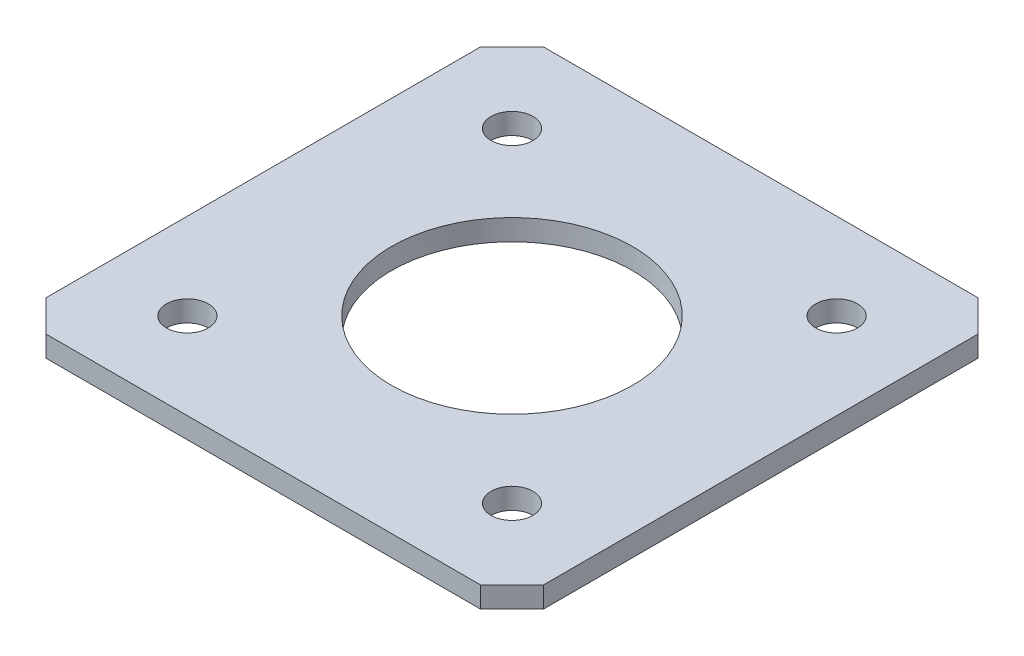
ISO-10303-21;
HEADER;
FILE_DESCRIPTION(('STEP AP214'),'2;1');
FILE_NAME('part.step','',(''),(''),'','','');
FILE_SCHEMA(('AUTOMOTIVE_DESIGN { 1 0 10303 214 1 1 1 1 }'));
ENDSEC;
DATA;
#1=APPLICATION_CONTEXT('core data for automotive mechanical design processes');
#2=APPLICATION_PROTOCOL_DEFINITION('international standard','automotive_design',2000,#1);
#3=PRODUCT_CONTEXT('',#1,'mechanical');
#4=PRODUCT('Part','Part','',(#3));
#5=PRODUCT_RELATED_PRODUCT_CATEGORY('part','',(#4));
#6=PRODUCT_DEFINITION_FORMATION('','',#4);
#7=PRODUCT_DEFINITION_CONTEXT('part definition',#1,'design');
#8=PRODUCT_DEFINITION('design','',#6,#7);
#9=PRODUCT_DEFINITION_SHAPE('','',#8);
#10=(LENGTH_UNIT() NAMED_UNIT(*) SI_UNIT(.MILLI.,.METRE.));
#11=(NAMED_UNIT(*) PLANE_ANGLE_UNIT() SI_UNIT($,.RADIAN.));
#12=(NAMED_UNIT(*) SI_UNIT($,.STERADIAN.) SOLID_ANGLE_UNIT());
#13=UNCERTAINTY_MEASURE_WITH_UNIT(LENGTH_MEASURE(1.E-05),#10,'distance_accuracy_value','');
#14=(GEOMETRIC_REPRESENTATION_CONTEXT(3) GLOBAL_UNCERTAINTY_ASSIGNED_CONTEXT((#13)) GLOBAL_UNIT_ASSIGNED_CONTEXT((#10,
#11,#12)) REPRESENTATION_CONTEXT('',''));
#15=CARTESIAN_POINT('',(0.,0.,0.));
#16=DIRECTION('',(0.,0.,1.));
#17=DIRECTION('',(1.,0.,0.));
#18=AXIS2_PLACEMENT_3D('',#15,#16,#17);
#19=CARTESIAN_POINT('',(0.,2.,0.));
#20=DIRECTION('',(0.,-1.,0.));
#21=DIRECTION('',(0.,0.,-1.));
#22=AXIS2_PLACEMENT_3D('',#19,#20,#21);
#23=PLANE('',#22);
#24=DIRECTION('',(0.,0.,-1.));
#25=VECTOR('',#24,1.);
#26=CARTESIAN_POINT('',(23.75,2.,23.75));
#27=LINE('',#26,#25);
#28=CARTESIAN_POINT('',(23.75,2.,20.75));
#29=VERTEX_POINT('',#28);
#30=CARTESIAN_POINT('',(23.75,2.,-20.75));
#31=VERTEX_POINT('',#30);
#32=EDGE_CURVE('E143',#29,#31,#27,.T.);
#33=ORIENTED_EDGE('',*,*,#32,.T.);
#34=DIRECTION('',(0.707106781186546,0.,0.707106781186549));
#35=VECTOR('',#34,1.);
#36=CARTESIAN_POINT('',(20.75,2.,-23.75));
#37=LINE('',#36,#35);
#38=CARTESIAN_POINT('',(20.75,2.,-23.75));
#39=VERTEX_POINT('',#38);
#40=EDGE_CURVE('E158',#31,#39,#37,.F.);
#41=ORIENTED_EDGE('',*,*,#40,.T.);
#42=DIRECTION('',(-1.,0.,0.));
#43=VECTOR('',#42,1.);
#44=CARTESIAN_POINT('',(-23.75,2.,-23.75));
#45=LINE('',#44,#43);
#46=CARTESIAN_POINT('',(-20.75,2.,-23.75));
#47=VERTEX_POINT('',#46);
#48=EDGE_CURVE('E125',#39,#47,#45,.T.);
#49=ORIENTED_EDGE('',*,*,#48,.T.);
#50=DIRECTION('',(0.707106781186549,0.,-0.707106781186546));
#51=VECTOR('',#50,1.);
#52=CARTESIAN_POINT('',(-23.75,2.,-20.75));
#53=LINE('',#52,#51);
#54=CARTESIAN_POINT('',(-23.75,2.,-20.75));
#55=VERTEX_POINT('',#54);
#56=EDGE_CURVE('E156',#47,#55,#53,.F.);
#57=ORIENTED_EDGE('',*,*,#56,.T.);
#58=DIRECTION('',(0.,0.,1.));
#59=VECTOR('',#58,1.);
#60=CARTESIAN_POINT('',(-23.75,2.,23.75));
#61=LINE('',#60,#59);
#62=CARTESIAN_POINT('',(-23.75,2.,20.75));
#63=VERTEX_POINT('',#62);
#64=EDGE_CURVE('E169',#55,#63,#61,.T.);
#65=ORIENTED_EDGE('',*,*,#64,.T.);
#66=DIRECTION('',(-0.707106781186546,0.,-0.707106781186549));
#67=VECTOR('',#66,1.);
#68=CARTESIAN_POINT('',(-20.75,2.,23.75));
#69=LINE('',#68,#67);
#70=CARTESIAN_POINT('',(-20.75,2.,23.75));
#71=VERTEX_POINT('',#70);
#72=EDGE_CURVE('E60',#63,#71,#69,.F.);
#73=ORIENTED_EDGE('',*,*,#72,.T.);
#74=DIRECTION('',(1.,0.,0.));
#75=VECTOR('',#74,1.);
#76=CARTESIAN_POINT('',(-23.75,2.,23.75));
#77=LINE('',#76,#75);
#78=CARTESIAN_POINT('',(20.75,2.,23.75));
#79=VERTEX_POINT('',#78);
#80=EDGE_CURVE('E144',#71,#79,#77,.T.);
#81=ORIENTED_EDGE('',*,*,#80,.T.);
#82=DIRECTION('',(-0.707106781186549,0.,0.707106781186546));
#83=VECTOR('',#82,1.);
#84=CARTESIAN_POINT('',(23.75,2.,20.75));
#85=LINE('',#84,#83);
#86=EDGE_CURVE('E153',#79,#29,#85,.F.);
#87=ORIENTED_EDGE('',*,*,#86,.T.);
#88=EDGE_LOOP('',(#33,#41,#49,#57,#65,#73,#81,#87));
#89=FACE_BOUND('',#88,.T.);
#90=CARTESIAN_POINT('',(-15.5,2.,-15.5));
#91=DIRECTION('',(0.,1.,0.));
#92=DIRECTION('',(0.,0.,1.));
#93=AXIS2_PLACEMENT_3D('',#90,#91,#92);
#94=CIRCLE('',#93,2.);
#95=CARTESIAN_POINT('',(-15.5,2.,-13.5));
#96=VERTEX_POINT('',#95);
#97=EDGE_CURVE('E138',#96,#96,#94,.T.);
#98=ORIENTED_EDGE('',*,*,#97,.F.);
#99=EDGE_LOOP('',(#98));
#100=FACE_BOUND('',#99,.T.);
#101=CARTESIAN_POINT('',(0.,2.,0.));
#102=DIRECTION('',(0.,1.,0.));
#103=DIRECTION('',(0.,0.,1.));
#104=AXIS2_PLACEMENT_3D('',#101,#102,#103);
#105=CIRCLE('',#104,11.5);
#106=CARTESIAN_POINT('',(0.,2.,11.5));
#107=VERTEX_POINT('',#106);
#108=EDGE_CURVE('E186',#107,#107,#105,.T.);
#109=ORIENTED_EDGE('',*,*,#108,.F.);
#110=EDGE_LOOP('',(#109));
#111=FACE_BOUND('',#110,.T.);
#112=CARTESIAN_POINT('',(15.5,2.,-15.5000000000009));
#113=DIRECTION('',(0.,1.,0.));
#114=DIRECTION('',(0.,0.,1.));
#115=AXIS2_PLACEMENT_3D('',#112,#113,#114);
#116=CIRCLE('',#115,2.);
#117=CARTESIAN_POINT('',(15.5,2.,-13.5000000000009));
#118=VERTEX_POINT('',#117);
#119=EDGE_CURVE('E192',#118,#118,#116,.T.);
#120=ORIENTED_EDGE('',*,*,#119,.F.);
#121=EDGE_LOOP('',(#120));
#122=FACE_BOUND('',#121,.T.);
#123=CARTESIAN_POINT('',(15.5000000000009,2.,15.4999999999991));
#124=DIRECTION('',(0.,1.,0.));
#125=DIRECTION('',(0.,0.,1.));
#126=AXIS2_PLACEMENT_3D('',#123,#124,#125);
#127=CIRCLE('',#126,2.);
#128=CARTESIAN_POINT('',(15.5000000000009,2.,17.4999999999991));
#129=VERTEX_POINT('',#128);
#130=EDGE_CURVE('E198',#129,#129,#127,.T.);
#131=ORIENTED_EDGE('',*,*,#130,.F.);
#132=EDGE_LOOP('',(#131));
#133=FACE_BOUND('',#132,.T.);
#134=CARTESIAN_POINT('',(-15.4999999999991,2.,15.5));
#135=DIRECTION('',(0.,1.,0.));
#136=DIRECTION('',(0.,0.,1.));
#137=AXIS2_PLACEMENT_3D('',#134,#135,#136);
#138=CIRCLE('',#137,2.);
#139=CARTESIAN_POINT('',(-15.4999999999991,2.,17.5));
#140=VERTEX_POINT('',#139);
#141=EDGE_CURVE('E204',#140,#140,#138,.T.);
#142=ORIENTED_EDGE('',*,*,#141,.F.);
#143=EDGE_LOOP('',(#142));
#144=FACE_BOUND('',#143,.T.);
#145=ADVANCED_FACE('F38',(#89,#100,#111,#122,#133,#144),#23,.F.);
#146=CARTESIAN_POINT('',(0.,0.,0.));
#147=DIRECTION('',(0.,-1.,0.));
#148=DIRECTION('',(0.,0.,-1.));
#149=AXIS2_PLACEMENT_3D('',#146,#147,#148);
#150=PLANE('',#149);
#151=CARTESIAN_POINT('',(15.5000000000009,0.,15.4999999999991));
#152=DIRECTION('',(0.,1.,0.));
#153=DIRECTION('',(0.,0.,1.));
#154=AXIS2_PLACEMENT_3D('',#151,#152,#153);
#155=CIRCLE('',#154,2.);
#156=CARTESIAN_POINT('',(15.5000000000009,0.,17.4999999999991));
#157=VERTEX_POINT('',#156);
#158=EDGE_CURVE('E201',#157,#157,#155,.T.);
#159=ORIENTED_EDGE('',*,*,#158,.T.);
#160=EDGE_LOOP('',(#159));
#161=FACE_BOUND('',#160,.T.);
#162=CARTESIAN_POINT('',(0.,0.,0.));
#163=DIRECTION('',(0.,1.,0.));
#164=DIRECTION('',(0.,0.,1.));
#165=AXIS2_PLACEMENT_3D('',#162,#163,#164);
#166=CIRCLE('',#165,11.5);
#167=CARTESIAN_POINT('',(0.,0.,11.5));
#168=VERTEX_POINT('',#167);
#169=EDGE_CURVE('E189',#168,#168,#166,.T.);
#170=ORIENTED_EDGE('',*,*,#169,.T.);
#171=EDGE_LOOP('',(#170));
#172=FACE_BOUND('',#171,.T.);
#173=DIRECTION('',(-1.,0.,0.));
#174=VECTOR('',#173,1.);
#175=CARTESIAN_POINT('',(-23.75,0.,-23.75));
#176=LINE('',#175,#174);
#177=CARTESIAN_POINT('',(20.75,0.,-23.75));
#178=VERTEX_POINT('',#177);
#179=CARTESIAN_POINT('',(-20.75,0.,-23.75));
#180=VERTEX_POINT('',#179);
#181=EDGE_CURVE('E122',#178,#180,#176,.T.);
#182=ORIENTED_EDGE('',*,*,#181,.F.);
#183=DIRECTION('',(-0.707106781186546,0.,-0.707106781186549));
#184=VECTOR('',#183,1.);
#185=CARTESIAN_POINT('',(22.25,0.,-22.2499999999999));
#186=LINE('',#185,#184);
#187=CARTESIAN_POINT('',(23.75,0.,-20.75));
#188=VERTEX_POINT('',#187);
#189=EDGE_CURVE('E105',#178,#188,#186,.F.);
#190=ORIENTED_EDGE('',*,*,#189,.T.);
#191=DIRECTION('',(0.,0.,-1.));
#192=VECTOR('',#191,1.);
#193=CARTESIAN_POINT('',(23.75,0.,23.75));
#194=LINE('',#193,#192);
#195=CARTESIAN_POINT('',(23.75,0.,20.75));
#196=VERTEX_POINT('',#195);
#197=EDGE_CURVE('E133',#196,#188,#194,.T.);
#198=ORIENTED_EDGE('',*,*,#197,.F.);
#199=DIRECTION('',(0.707106781186549,0.,-0.707106781186546));
#200=VECTOR('',#199,1.);
#201=CARTESIAN_POINT('',(22.2499999999999,0.,22.25));
#202=LINE('',#201,#200);
#203=CARTESIAN_POINT('',(20.75,0.,23.75));
#204=VERTEX_POINT('',#203);
#205=EDGE_CURVE('E126',#196,#204,#202,.F.);
#206=ORIENTED_EDGE('',*,*,#205,.T.);
#207=DIRECTION('',(1.,0.,0.));
#208=VECTOR('',#207,1.);
#209=CARTESIAN_POINT('',(-23.75,0.,23.75));
#210=LINE('',#209,#208);
#211=CARTESIAN_POINT('',(-20.75,0.,23.75));
#212=VERTEX_POINT('',#211);
#213=EDGE_CURVE('E136',#212,#204,#210,.T.);
#214=ORIENTED_EDGE('',*,*,#213,.F.);
#215=DIRECTION('',(0.707106781186546,0.,0.707106781186549));
#216=VECTOR('',#215,1.);
#217=CARTESIAN_POINT('',(-22.25,0.,22.2499999999999));
#218=LINE('',#217,#216);
#219=CARTESIAN_POINT('',(-23.75,0.,20.75));
#220=VERTEX_POINT('',#219);
#221=EDGE_CURVE('E147',#212,#220,#218,.F.);
#222=ORIENTED_EDGE('',*,*,#221,.T.);
#223=DIRECTION('',(0.,0.,1.));
#224=VECTOR('',#223,1.);
#225=CARTESIAN_POINT('',(-23.75,0.,23.75));
#226=LINE('',#225,#224);
#227=CARTESIAN_POINT('',(-23.75,0.,-20.75));
#228=VERTEX_POINT('',#227);
#229=EDGE_CURVE('E132',#228,#220,#226,.T.);
#230=ORIENTED_EDGE('',*,*,#229,.F.);
#231=DIRECTION('',(-0.707106781186549,0.,0.707106781186546));
#232=VECTOR('',#231,1.);
#233=CARTESIAN_POINT('',(-22.2499999999999,0.,-22.25));
#234=LINE('',#233,#232);
#235=EDGE_CURVE('E116',#228,#180,#234,.F.);
#236=ORIENTED_EDGE('',*,*,#235,.T.);
#237=EDGE_LOOP('',(#182,#190,#198,#206,#214,#222,#230,#236));
#238=FACE_BOUND('',#237,.T.);
#239=CARTESIAN_POINT('',(-15.5,0.,-15.5));
#240=DIRECTION('',(0.,1.,0.));
#241=DIRECTION('',(0.,0.,1.));
#242=AXIS2_PLACEMENT_3D('',#239,#240,#241);
#243=CIRCLE('',#242,2.);
#244=CARTESIAN_POINT('',(-15.5,0.,-13.5));
#245=VERTEX_POINT('',#244);
#246=EDGE_CURVE('E183',#245,#245,#243,.T.);
#247=ORIENTED_EDGE('',*,*,#246,.T.);
#248=EDGE_LOOP('',(#247));
#249=FACE_BOUND('',#248,.T.);
#250=CARTESIAN_POINT('',(15.5,0.,-15.5000000000009));
#251=DIRECTION('',(0.,1.,0.));
#252=DIRECTION('',(0.,0.,1.));
#253=AXIS2_PLACEMENT_3D('',#250,#251,#252);
#254=CIRCLE('',#253,2.);
#255=CARTESIAN_POINT('',(15.5,0.,-13.5000000000009));
#256=VERTEX_POINT('',#255);
#257=EDGE_CURVE('E195',#256,#256,#254,.T.);
#258=ORIENTED_EDGE('',*,*,#257,.T.);
#259=EDGE_LOOP('',(#258));
#260=FACE_BOUND('',#259,.T.);
#261=CARTESIAN_POINT('',(-15.4999999999991,0.,15.5));
#262=DIRECTION('',(0.,1.,0.));
#263=DIRECTION('',(0.,0.,1.));
#264=AXIS2_PLACEMENT_3D('',#261,#262,#263);
#265=CIRCLE('',#264,2.);
#266=CARTESIAN_POINT('',(-15.4999999999991,0.,17.5));
#267=VERTEX_POINT('',#266);
#268=EDGE_CURVE('E207',#267,#267,#265,.T.);
#269=ORIENTED_EDGE('',*,*,#268,.T.);
#270=EDGE_LOOP('',(#269));
#271=FACE_BOUND('',#270,.T.);
#272=ADVANCED_FACE('F129',(#161,#172,#238,#249,#260,#271),#150,.T.);
#273=CARTESIAN_POINT('',(23.75,2.,23.75));
#274=DIRECTION('',(-1.,0.,0.));
#275=DIRECTION('',(0.,0.,1.));
#276=AXIS2_PLACEMENT_3D('',#273,#274,#275);
#277=PLANE('',#276);
#278=ORIENTED_EDGE('',*,*,#197,.T.);
#279=DIRECTION('',(0.,1.,0.));
#280=VECTOR('',#279,1.);
#281=CARTESIAN_POINT('',(23.75,2.,-20.75));
#282=LINE('',#281,#280);
#283=EDGE_CURVE('E110',#188,#31,#282,.T.);
#284=ORIENTED_EDGE('',*,*,#283,.T.);
#285=ORIENTED_EDGE('',*,*,#32,.F.);
#286=DIRECTION('',(0.,-1.,0.));
#287=VECTOR('',#286,1.);
#288=CARTESIAN_POINT('',(23.75,2.,20.75));
#289=LINE('',#288,#287);
#290=EDGE_CURVE('E115',#29,#196,#289,.T.);
#291=ORIENTED_EDGE('',*,*,#290,.T.);
#292=EDGE_LOOP('',(#278,#284,#285,#291));
#293=FACE_BOUND('',#292,.T.);
#294=ADVANCED_FACE('F221',(#293),#277,.F.);
#295=CARTESIAN_POINT('',(-23.75,2.,-23.75));
#296=DIRECTION('',(0.,0.,1.));
#297=DIRECTION('',(1.,0.,0.));
#298=AXIS2_PLACEMENT_3D('',#295,#296,#297);
#299=PLANE('',#298);
#300=ORIENTED_EDGE('',*,*,#48,.F.);
#301=DIRECTION('',(0.,-1.,0.));
#302=VECTOR('',#301,1.);
#303=CARTESIAN_POINT('',(20.75,2.,-23.75));
#304=LINE('',#303,#302);
#305=EDGE_CURVE('E109',#39,#178,#304,.T.);
#306=ORIENTED_EDGE('',*,*,#305,.T.);
#307=ORIENTED_EDGE('',*,*,#181,.T.);
#308=DIRECTION('',(0.,1.,0.));
#309=VECTOR('',#308,1.);
#310=CARTESIAN_POINT('',(-20.75,2.,-23.75));
#311=LINE('',#310,#309);
#312=EDGE_CURVE('E127',#180,#47,#311,.T.);
#313=ORIENTED_EDGE('',*,*,#312,.T.);
#314=EDGE_LOOP('',(#300,#306,#307,#313));
#315=FACE_BOUND('',#314,.T.);
#316=ADVANCED_FACE('F121',(#315),#299,.F.);
#317=CARTESIAN_POINT('',(-23.75,2.,23.75));
#318=DIRECTION('',(1.,0.,0.));
#319=DIRECTION('',(0.,0.,-1.));
#320=AXIS2_PLACEMENT_3D('',#317,#318,#319);
#321=PLANE('',#320);
#322=ORIENTED_EDGE('',*,*,#64,.F.);
#323=DIRECTION('',(0.,-1.,0.));
#324=VECTOR('',#323,1.);
#325=CARTESIAN_POINT('',(-23.75,2.,-20.75));
#326=LINE('',#325,#324);
#327=EDGE_CURVE('E162',#55,#228,#326,.T.);
#328=ORIENTED_EDGE('',*,*,#327,.T.);
#329=ORIENTED_EDGE('',*,*,#229,.T.);
#330=DIRECTION('',(0.,1.,0.));
#331=VECTOR('',#330,1.);
#332=CARTESIAN_POINT('',(-23.75,2.,20.75));
#333=LINE('',#332,#331);
#334=EDGE_CURVE('E160',#220,#63,#333,.T.);
#335=ORIENTED_EDGE('',*,*,#334,.T.);
#336=EDGE_LOOP('',(#322,#328,#329,#335));
#337=FACE_BOUND('',#336,.T.);
#338=ADVANCED_FACE('F167',(#337),#321,.F.);
#339=CARTESIAN_POINT('',(-23.75,2.,23.75));
#340=DIRECTION('',(0.,0.,-1.));
#341=DIRECTION('',(-1.,0.,0.));
#342=AXIS2_PLACEMENT_3D('',#339,#340,#341);
#343=PLANE('',#342);
#344=ORIENTED_EDGE('',*,*,#80,.F.);
#345=DIRECTION('',(0.,-1.,0.));
#346=VECTOR('',#345,1.);
#347=CARTESIAN_POINT('',(-20.75,2.,23.75));
#348=LINE('',#347,#346);
#349=EDGE_CURVE('E11',#71,#212,#348,.T.);
#350=ORIENTED_EDGE('',*,*,#349,.T.);
#351=ORIENTED_EDGE('',*,*,#213,.T.);
#352=DIRECTION('',(0.,1.,0.));
#353=VECTOR('',#352,1.);
#354=CARTESIAN_POINT('',(20.75,2.,23.75));
#355=LINE('',#354,#353);
#356=EDGE_CURVE('E47',#204,#79,#355,.T.);
#357=ORIENTED_EDGE('',*,*,#356,.T.);
#358=EDGE_LOOP('',(#344,#350,#351,#357));
#359=FACE_BOUND('',#358,.T.);
#360=ADVANCED_FACE('F176',(#359),#343,.F.);
#361=CARTESIAN_POINT('',(-15.5,2.,-15.5));
#362=DIRECTION('',(0.,-1.,0.));
#363=DIRECTION('',(0.,0.,-1.));
#364=AXIS2_PLACEMENT_3D('',#361,#362,#363);
#365=CYLINDRICAL_SURFACE('',#364,2.);
#366=ORIENTED_EDGE('',*,*,#97,.T.);
#367=EDGE_LOOP('',(#366));
#368=FACE_BOUND('',#367,.T.);
#369=ORIENTED_EDGE('',*,*,#246,.F.);
#370=EDGE_LOOP('',(#369));
#371=FACE_BOUND('',#370,.T.);
#372=ADVANCED_FACE('F226',(#368,#371),#365,.F.);
#373=CARTESIAN_POINT('',(0.,2.,0.));
#374=DIRECTION('',(0.,-1.,0.));
#375=DIRECTION('',(0.,0.,-1.));
#376=AXIS2_PLACEMENT_3D('',#373,#374,#375);
#377=CYLINDRICAL_SURFACE('',#376,11.5);
#378=ORIENTED_EDGE('',*,*,#108,.T.);
#379=EDGE_LOOP('',(#378));
#380=FACE_BOUND('',#379,.T.);
#381=ORIENTED_EDGE('',*,*,#169,.F.);
#382=EDGE_LOOP('',(#381));
#383=FACE_BOUND('',#382,.T.);
#384=ADVANCED_FACE('F340',(#380,#383),#377,.F.);
#385=CARTESIAN_POINT('',(15.5,2.,-15.5000000000009));
#386=DIRECTION('',(0.,-1.,0.));
#387=DIRECTION('',(0.,0.,-1.));
#388=AXIS2_PLACEMENT_3D('',#385,#386,#387);
#389=CYLINDRICAL_SURFACE('',#388,2.);
#390=ORIENTED_EDGE('',*,*,#119,.T.);
#391=EDGE_LOOP('',(#390));
#392=FACE_BOUND('',#391,.T.);
#393=ORIENTED_EDGE('',*,*,#257,.F.);
#394=EDGE_LOOP('',(#393));
#395=FACE_BOUND('',#394,.T.);
#396=ADVANCED_FACE('F330',(#392,#395),#389,.F.);
#397=CARTESIAN_POINT('',(15.5000000000009,2.,15.4999999999991));
#398=DIRECTION('',(0.,-1.,0.));
#399=DIRECTION('',(0.,0.,-1.));
#400=AXIS2_PLACEMENT_3D('',#397,#398,#399);
#401=CYLINDRICAL_SURFACE('',#400,2.);
#402=ORIENTED_EDGE('',*,*,#130,.T.);
#403=EDGE_LOOP('',(#402));
#404=FACE_BOUND('',#403,.T.);
#405=ORIENTED_EDGE('',*,*,#158,.F.);
#406=EDGE_LOOP('',(#405));
#407=FACE_BOUND('',#406,.T.);
#408=ADVANCED_FACE('F321',(#404,#407),#401,.F.);
#409=CARTESIAN_POINT('',(-15.4999999999991,2.,15.5));
#410=DIRECTION('',(0.,-1.,0.));
#411=DIRECTION('',(0.,0.,-1.));
#412=AXIS2_PLACEMENT_3D('',#409,#410,#411);
#413=CYLINDRICAL_SURFACE('',#412,2.);
#414=ORIENTED_EDGE('',*,*,#141,.T.);
#415=EDGE_LOOP('',(#414));
#416=FACE_BOUND('',#415,.T.);
#417=ORIENTED_EDGE('',*,*,#268,.F.);
#418=EDGE_LOOP('',(#417));
#419=FACE_BOUND('',#418,.T.);
#420=ADVANCED_FACE('F213',(#416,#419),#413,.F.);
#421=CARTESIAN_POINT('',(20.75,2.,-23.75));
#422=DIRECTION('',(-0.707106781186549,0.,0.707106781186546));
#423=DIRECTION('',(0.,-1.,0.));
#424=AXIS2_PLACEMENT_3D('',#421,#422,#423);
#425=PLANE('',#424);
#426=ORIENTED_EDGE('',*,*,#40,.F.);
#427=ORIENTED_EDGE('',*,*,#283,.F.);
#428=ORIENTED_EDGE('',*,*,#189,.F.);
#429=ORIENTED_EDGE('',*,*,#305,.F.);
#430=EDGE_LOOP('',(#426,#427,#428,#429));
#431=FACE_BOUND('',#430,.T.);
#432=ADVANCED_FACE('F108',(#431),#425,.F.);
#433=CARTESIAN_POINT('',(-23.75,2.,-20.75));
#434=DIRECTION('',(0.707106781186546,0.,0.707106781186549));
#435=DIRECTION('',(0.,-1.,0.));
#436=AXIS2_PLACEMENT_3D('',#433,#434,#435);
#437=PLANE('',#436);
#438=ORIENTED_EDGE('',*,*,#56,.F.);
#439=ORIENTED_EDGE('',*,*,#312,.F.);
#440=ORIENTED_EDGE('',*,*,#235,.F.);
#441=ORIENTED_EDGE('',*,*,#327,.F.);
#442=EDGE_LOOP('',(#438,#439,#440,#441));
#443=FACE_BOUND('',#442,.T.);
#444=ADVANCED_FACE('F244',(#443),#437,.F.);
#445=CARTESIAN_POINT('',(-20.75,2.,23.75));
#446=DIRECTION('',(0.707106781186549,0.,-0.707106781186546));
#447=DIRECTION('',(0.,-1.,0.));
#448=AXIS2_PLACEMENT_3D('',#445,#446,#447);
#449=PLANE('',#448);
#450=ORIENTED_EDGE('',*,*,#72,.F.);
#451=ORIENTED_EDGE('',*,*,#334,.F.);
#452=ORIENTED_EDGE('',*,*,#221,.F.);
#453=ORIENTED_EDGE('',*,*,#349,.F.);
#454=EDGE_LOOP('',(#450,#451,#452,#453));
#455=FACE_BOUND('',#454,.T.);
#456=ADVANCED_FACE('F175',(#455),#449,.F.);
#457=CARTESIAN_POINT('',(23.75,2.,20.75));
#458=DIRECTION('',(-0.707106781186546,0.,-0.707106781186549));
#459=DIRECTION('',(0.,-1.,0.));
#460=AXIS2_PLACEMENT_3D('',#457,#458,#459);
#461=PLANE('',#460);
#462=ORIENTED_EDGE('',*,*,#86,.F.);
#463=ORIENTED_EDGE('',*,*,#356,.F.);
#464=ORIENTED_EDGE('',*,*,#205,.F.);
#465=ORIENTED_EDGE('',*,*,#290,.F.);
#466=EDGE_LOOP('',(#462,#463,#464,#465));
#467=FACE_BOUND('',#466,.T.);
#468=ADVANCED_FACE('F41',(#467),#461,.F.);
#469=CLOSED_SHELL('',(#145,#272,#294,#316,#338,#360,#372,#384,#396,#408,#420,#432,#444,#456,#468));
#470=MANIFOLD_SOLID_BREP('B2',#469);
#471=ADVANCED_BREP_SHAPE_REPRESENTATION('',(#18,#470),#14);
#472=SHAPE_DEFINITION_REPRESENTATION(#9,#471);
ENDSEC;
END-ISO-10303-21;
